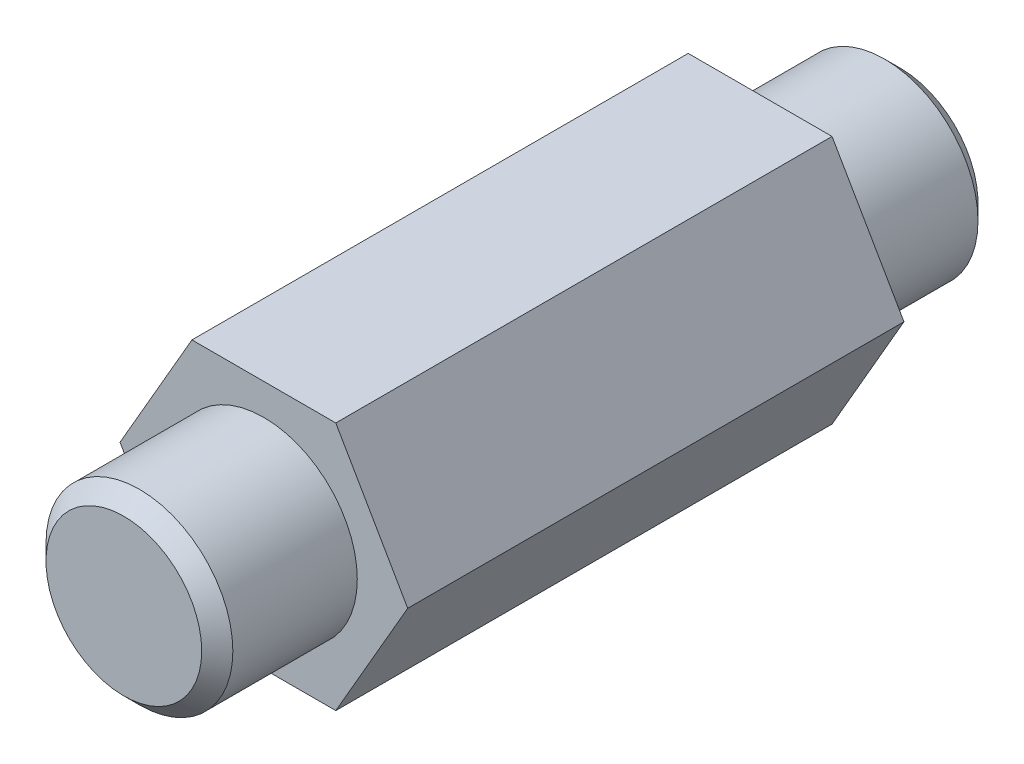
ISO-10303-21;
HEADER;
FILE_DESCRIPTION(('STEP AP214'),'2;1');
FILE_NAME('part.step','',(''),(''),'','','');
FILE_SCHEMA(('AUTOMOTIVE_DESIGN { 1 0 10303 214 1 1 1 1 }'));
ENDSEC;
DATA;
#1=APPLICATION_CONTEXT('core data for automotive mechanical design processes');
#2=APPLICATION_PROTOCOL_DEFINITION('international standard','automotive_design',2000,#1);
#3=PRODUCT_CONTEXT('',#1,'mechanical');
#4=PRODUCT('Part','Part','',(#3));
#5=PRODUCT_RELATED_PRODUCT_CATEGORY('part','',(#4));
#6=PRODUCT_DEFINITION_FORMATION('','',#4);
#7=PRODUCT_DEFINITION_CONTEXT('part definition',#1,'design');
#8=PRODUCT_DEFINITION('design','',#6,#7);
#9=PRODUCT_DEFINITION_SHAPE('','',#8);
#10=(LENGTH_UNIT() NAMED_UNIT(*) SI_UNIT(.MILLI.,.METRE.));
#11=(NAMED_UNIT(*) PLANE_ANGLE_UNIT() SI_UNIT($,.RADIAN.));
#12=(NAMED_UNIT(*) SI_UNIT($,.STERADIAN.) SOLID_ANGLE_UNIT());
#13=UNCERTAINTY_MEASURE_WITH_UNIT(LENGTH_MEASURE(1.E-05),#10,'distance_accuracy_value','');
#14=(GEOMETRIC_REPRESENTATION_CONTEXT(3) GLOBAL_UNCERTAINTY_ASSIGNED_CONTEXT((#13)) GLOBAL_UNIT_ASSIGNED_CONTEXT((#10,
#11,#12)) REPRESENTATION_CONTEXT('',''));
#15=CARTESIAN_POINT('',(0.,0.,0.));
#16=DIRECTION('',(0.,0.,1.));
#17=DIRECTION('',(1.,0.,0.));
#18=AXIS2_PLACEMENT_3D('',#15,#16,#17);
#19=CARTESIAN_POINT('',(-3.66617420935412,-6.35,19.7866));
#20=DIRECTION('',(0.,1.,0.));
#21=DIRECTION('',(0.,0.,1.));
#22=AXIS2_PLACEMENT_3D('',#19,#20,#21);
#23=PLANE('',#22);
#24=DIRECTION('',(-1.,0.,0.));
#25=VECTOR('',#24,1.);
#26=CARTESIAN_POINT('',(-3.66617420935412,-6.35,-12.6492));
#27=LINE('',#26,#25);
#28=CARTESIAN_POINT('',(3.66617420935412,-6.35,-12.6492));
#29=VERTEX_POINT('',#28);
#30=CARTESIAN_POINT('',(-3.66617420935412,-6.35,-12.6492));
#31=VERTEX_POINT('',#30);
#32=EDGE_CURVE('E48',#29,#31,#27,.T.);
#33=ORIENTED_EDGE('',*,*,#32,.F.);
#34=DIRECTION('',(0.,0.,-1.));
#35=VECTOR('',#34,1.);
#36=CARTESIAN_POINT('',(3.66617420935412,-6.35,19.7866));
#37=LINE('',#36,#35);
#38=CARTESIAN_POINT('',(3.66617420935412,-6.35,12.6492));
#39=VERTEX_POINT('',#38);
#40=EDGE_CURVE('E115',#39,#29,#37,.T.);
#41=ORIENTED_EDGE('',*,*,#40,.F.);
#42=DIRECTION('',(1.,0.,0.));
#43=VECTOR('',#42,1.);
#44=CARTESIAN_POINT('',(-3.66617420935412,-6.35,12.6492));
#45=LINE('',#44,#43);
#46=CARTESIAN_POINT('',(-3.66617420935412,-6.35,12.6492));
#47=VERTEX_POINT('',#46);
#48=EDGE_CURVE('E106',#47,#39,#45,.T.);
#49=ORIENTED_EDGE('',*,*,#48,.F.);
#50=DIRECTION('',(0.,0.,-1.));
#51=VECTOR('',#50,1.);
#52=CARTESIAN_POINT('',(-3.66617420935412,-6.35,19.7866));
#53=LINE('',#52,#51);
#54=EDGE_CURVE('E102',#47,#31,#53,.T.);
#55=ORIENTED_EDGE('',*,*,#54,.T.);
#56=EDGE_LOOP('',(#33,#41,#49,#55));
#57=FACE_BOUND('',#56,.T.);
#58=ADVANCED_FACE('F35',(#57),#23,.F.);
#59=CARTESIAN_POINT('',(3.66617420935412,-6.35,19.7866));
#60=DIRECTION('',(-0.866025403784439,0.5,0.));
#61=DIRECTION('',(-0.5,-0.866025403784439,0.));
#62=AXIS2_PLACEMENT_3D('',#59,#60,#61);
#63=PLANE('',#62);
#64=DIRECTION('',(-0.5,-0.866025403784439,0.));
#65=VECTOR('',#64,1.);
#66=CARTESIAN_POINT('',(3.66617420935412,-6.35,-12.6492));
#67=LINE('',#66,#65);
#68=CARTESIAN_POINT('',(7.33234841870824,0.,-12.6492));
#69=VERTEX_POINT('',#68);
#70=EDGE_CURVE('E140',#69,#29,#67,.T.);
#71=ORIENTED_EDGE('',*,*,#70,.F.);
#72=DIRECTION('',(0.,0.,-1.));
#73=VECTOR('',#72,1.);
#74=CARTESIAN_POINT('',(7.33234841870824,0.,19.7866));
#75=LINE('',#74,#73);
#76=CARTESIAN_POINT('',(7.33234841870824,0.,12.6492));
#77=VERTEX_POINT('',#76);
#78=EDGE_CURVE('E112',#77,#69,#75,.T.);
#79=ORIENTED_EDGE('',*,*,#78,.F.);
#80=DIRECTION('',(0.5,0.866025403784439,0.));
#81=VECTOR('',#80,1.);
#82=CARTESIAN_POINT('',(3.66617420935412,-6.35,12.6492));
#83=LINE('',#82,#81);
#84=EDGE_CURVE('E122',#39,#77,#83,.T.);
#85=ORIENTED_EDGE('',*,*,#84,.F.);
#86=ORIENTED_EDGE('',*,*,#40,.T.);
#87=EDGE_LOOP('',(#71,#79,#85,#86));
#88=FACE_BOUND('',#87,.T.);
#89=ADVANCED_FACE('F172',(#88),#63,.F.);
#90=CARTESIAN_POINT('',(7.33234841870824,0.,19.7866));
#91=DIRECTION('',(-0.866025403784438,-0.5,0.));
#92=DIRECTION('',(0.5,-0.866025403784438,0.));
#93=AXIS2_PLACEMENT_3D('',#90,#91,#92);
#94=PLANE('',#93);
#95=DIRECTION('',(0.5,-0.866025403784438,0.));
#96=VECTOR('',#95,1.);
#97=CARTESIAN_POINT('',(7.33234841870824,0.,-12.6492));
#98=LINE('',#97,#96);
#99=CARTESIAN_POINT('',(3.66617420935412,6.35,-12.6492));
#100=VERTEX_POINT('',#99);
#101=EDGE_CURVE('E142',#100,#69,#98,.T.);
#102=ORIENTED_EDGE('',*,*,#101,.F.);
#103=DIRECTION('',(0.,0.,-1.));
#104=VECTOR('',#103,1.);
#105=CARTESIAN_POINT('',(3.66617420935412,6.35,19.7866));
#106=LINE('',#105,#104);
#107=CARTESIAN_POINT('',(3.66617420935412,6.35,12.6492));
#108=VERTEX_POINT('',#107);
#109=EDGE_CURVE('E104',#108,#100,#106,.T.);
#110=ORIENTED_EDGE('',*,*,#109,.F.);
#111=DIRECTION('',(-0.5,0.866025403784438,0.));
#112=VECTOR('',#111,1.);
#113=CARTESIAN_POINT('',(7.33234841870824,0.,12.6492));
#114=LINE('',#113,#112);
#115=EDGE_CURVE('E123',#77,#108,#114,.T.);
#116=ORIENTED_EDGE('',*,*,#115,.F.);
#117=ORIENTED_EDGE('',*,*,#78,.T.);
#118=EDGE_LOOP('',(#102,#110,#116,#117));
#119=FACE_BOUND('',#118,.T.);
#120=ADVANCED_FACE('F176',(#119),#94,.F.);
#121=CARTESIAN_POINT('',(3.66617420935412,6.35,19.7866));
#122=DIRECTION('',(0.,-1.,0.));
#123=DIRECTION('',(1.,0.,0.));
#124=AXIS2_PLACEMENT_3D('',#121,#122,#123);
#125=PLANE('',#124);
#126=DIRECTION('',(1.,0.,0.));
#127=VECTOR('',#126,1.);
#128=CARTESIAN_POINT('',(3.66617420935412,6.35,-12.6492));
#129=LINE('',#128,#127);
#130=CARTESIAN_POINT('',(-3.66617420935412,6.35,-12.6492));
#131=VERTEX_POINT('',#130);
#132=EDGE_CURVE('E98',#131,#100,#129,.T.);
#133=ORIENTED_EDGE('',*,*,#132,.F.);
#134=DIRECTION('',(0.,0.,-1.));
#135=VECTOR('',#134,1.);
#136=CARTESIAN_POINT('',(-3.66617420935412,6.35,19.7866));
#137=LINE('',#136,#135);
#138=CARTESIAN_POINT('',(-3.66617420935412,6.35,12.6492));
#139=VERTEX_POINT('',#138);
#140=EDGE_CURVE('E97',#139,#131,#137,.T.);
#141=ORIENTED_EDGE('',*,*,#140,.F.);
#142=DIRECTION('',(-1.,0.,0.));
#143=VECTOR('',#142,1.);
#144=CARTESIAN_POINT('',(3.66617420935412,6.35,12.6492));
#145=LINE('',#144,#143);
#146=EDGE_CURVE('E127',#108,#139,#145,.T.);
#147=ORIENTED_EDGE('',*,*,#146,.F.);
#148=ORIENTED_EDGE('',*,*,#109,.T.);
#149=EDGE_LOOP('',(#133,#141,#147,#148));
#150=FACE_BOUND('',#149,.T.);
#151=ADVANCED_FACE('F181',(#150),#125,.F.);
#152=CARTESIAN_POINT('',(-3.66617420935412,6.35,19.7866));
#153=DIRECTION('',(0.866025403784439,-0.5,0.));
#154=DIRECTION('',(0.5,0.866025403784439,0.));
#155=AXIS2_PLACEMENT_3D('',#152,#153,#154);
#156=PLANE('',#155);
#157=DIRECTION('',(0.5,0.866025403784439,0.));
#158=VECTOR('',#157,1.);
#159=CARTESIAN_POINT('',(-3.66617420935412,6.35,-12.6492));
#160=LINE('',#159,#158);
#161=CARTESIAN_POINT('',(-7.33234841870824,0.,-12.6492));
#162=VERTEX_POINT('',#161);
#163=EDGE_CURVE('E85',#162,#131,#160,.T.);
#164=ORIENTED_EDGE('',*,*,#163,.F.);
#165=DIRECTION('',(0.,0.,-1.));
#166=VECTOR('',#165,1.);
#167=CARTESIAN_POINT('',(-7.33234841870824,0.,19.7866));
#168=LINE('',#167,#166);
#169=CARTESIAN_POINT('',(-7.33234841870824,0.,12.6492));
#170=VERTEX_POINT('',#169);
#171=EDGE_CURVE('E95',#170,#162,#168,.T.);
#172=ORIENTED_EDGE('',*,*,#171,.F.);
#173=DIRECTION('',(-0.5,-0.866025403784439,0.));
#174=VECTOR('',#173,1.);
#175=CARTESIAN_POINT('',(-3.66617420935412,6.35,12.6492));
#176=LINE('',#175,#174);
#177=EDGE_CURVE('E56',#139,#170,#176,.T.);
#178=ORIENTED_EDGE('',*,*,#177,.F.);
#179=ORIENTED_EDGE('',*,*,#140,.T.);
#180=EDGE_LOOP('',(#164,#172,#178,#179));
#181=FACE_BOUND('',#180,.T.);
#182=ADVANCED_FACE('F94',(#181),#156,.F.);
#183=CARTESIAN_POINT('',(-7.33234841870824,0.,19.7866));
#184=DIRECTION('',(0.866025403784438,0.5,0.));
#185=DIRECTION('',(-0.5,0.866025403784439,0.));
#186=AXIS2_PLACEMENT_3D('',#183,#184,#185);
#187=PLANE('',#186);
#188=DIRECTION('',(-0.5,0.866025403784439,0.));
#189=VECTOR('',#188,1.);
#190=CARTESIAN_POINT('',(-7.33234841870824,0.,-12.6492));
#191=LINE('',#190,#189);
#192=EDGE_CURVE('E11',#31,#162,#191,.T.);
#193=ORIENTED_EDGE('',*,*,#192,.F.);
#194=ORIENTED_EDGE('',*,*,#54,.F.);
#195=DIRECTION('',(0.5,-0.866025403784439,0.));
#196=VECTOR('',#195,1.);
#197=CARTESIAN_POINT('',(-7.33234841870824,0.,12.6492));
#198=LINE('',#197,#196);
#199=EDGE_CURVE('E42',#170,#47,#198,.T.);
#200=ORIENTED_EDGE('',*,*,#199,.F.);
#201=ORIENTED_EDGE('',*,*,#171,.T.);
#202=EDGE_LOOP('',(#193,#194,#200,#201));
#203=FACE_BOUND('',#202,.T.);
#204=ADVANCED_FACE('F101',(#203),#187,.F.);
#205=CARTESIAN_POINT('',(-4.7625,0.,12.6492));
#206=DIRECTION('',(0.,0.,1.));
#207=DIRECTION('',(1.,0.,0.));
#208=AXIS2_PLACEMENT_3D('',#205,#206,#207);
#209=PLANE('',#208);
#210=CARTESIAN_POINT('',(0.,0.,12.6492));
#211=DIRECTION('',(0.,0.,1.));
#212=DIRECTION('',(1.,0.,0.));
#213=AXIS2_PLACEMENT_3D('',#210,#211,#212);
#214=CIRCLE('',#213,4.7625);
#215=CARTESIAN_POINT('',(4.7625,0.,12.6492));
#216=VERTEX_POINT('',#215);
#217=EDGE_CURVE('E136',#216,#216,#214,.T.);
#218=ORIENTED_EDGE('',*,*,#217,.F.);
#219=EDGE_LOOP('',(#218));
#220=FACE_BOUND('',#219,.T.);
#221=ORIENTED_EDGE('',*,*,#48,.T.);
#222=ORIENTED_EDGE('',*,*,#84,.T.);
#223=ORIENTED_EDGE('',*,*,#115,.T.);
#224=ORIENTED_EDGE('',*,*,#146,.T.);
#225=ORIENTED_EDGE('',*,*,#177,.T.);
#226=ORIENTED_EDGE('',*,*,#199,.T.);
#227=EDGE_LOOP('',(#221,#222,#223,#224,#225,#226));
#228=FACE_BOUND('',#227,.T.);
#229=ADVANCED_FACE('F118',(#220,#228),#209,.T.);
#230=CARTESIAN_POINT('',(0.,0.,19.7866));
#231=DIRECTION('',(0.,0.,-1.));
#232=DIRECTION('',(-1.,0.,0.));
#233=AXIS2_PLACEMENT_3D('',#230,#231,#232);
#234=CONICAL_SURFACE('',#233,3.96875,0.78539816339745);
#235=CARTESIAN_POINT('',(0.,0.,18.99285));
#236=DIRECTION('',(0.,0.,1.));
#237=DIRECTION('',(1.,0.,0.));
#238=AXIS2_PLACEMENT_3D('',#235,#236,#237);
#239=CIRCLE('',#238,4.7625);
#240=CARTESIAN_POINT('',(4.7625,0.,18.99285));
#241=VERTEX_POINT('',#240);
#242=EDGE_CURVE('E133',#241,#241,#239,.T.);
#243=ORIENTED_EDGE('',*,*,#242,.T.);
#244=EDGE_LOOP('',(#243));
#245=FACE_BOUND('',#244,.T.);
#246=CARTESIAN_POINT('',(0.,0.,19.7866));
#247=DIRECTION('',(0.,0.,1.));
#248=DIRECTION('',(1.,0.,0.));
#249=AXIS2_PLACEMENT_3D('',#246,#247,#248);
#250=CIRCLE('',#249,3.96875);
#251=CARTESIAN_POINT('',(3.96875,0.,19.7866));
#252=VERTEX_POINT('',#251);
#253=EDGE_CURVE('E130',#252,#252,#250,.T.);
#254=ORIENTED_EDGE('',*,*,#253,.F.);
#255=EDGE_LOOP('',(#254));
#256=FACE_BOUND('',#255,.T.);
#257=ADVANCED_FACE('F197',(#245,#256),#234,.T.);
#258=CARTESIAN_POINT('',(0.,0.,19.7866));
#259=DIRECTION('',(0.,0.,1.));
#260=DIRECTION('',(1.,0.,0.));
#261=AXIS2_PLACEMENT_3D('',#258,#259,#260);
#262=CYLINDRICAL_SURFACE('',#261,4.7625);
#263=ORIENTED_EDGE('',*,*,#217,.T.);
#264=EDGE_LOOP('',(#263));
#265=FACE_BOUND('',#264,.T.);
#266=ORIENTED_EDGE('',*,*,#242,.F.);
#267=EDGE_LOOP('',(#266));
#268=FACE_BOUND('',#267,.T.);
#269=ADVANCED_FACE('F167',(#265,#268),#262,.T.);
#270=CARTESIAN_POINT('',(0.,0.,19.7866));
#271=DIRECTION('',(0.,0.,1.));
#272=DIRECTION('',(1.,0.,0.));
#273=AXIS2_PLACEMENT_3D('',#270,#271,#272);
#274=PLANE('',#273);
#275=ORIENTED_EDGE('',*,*,#253,.T.);
#276=EDGE_LOOP('',(#275));
#277=FACE_BOUND('',#276,.T.);
#278=ADVANCED_FACE('F159',(#277),#274,.T.);
#279=CARTESIAN_POINT('',(-4.7625,0.,-12.6492));
#280=DIRECTION('',(0.,0.,-1.));
#281=DIRECTION('',(-1.,0.,0.));
#282=AXIS2_PLACEMENT_3D('',#279,#280,#281);
#283=PLANE('',#282);
#284=CARTESIAN_POINT('',(0.,0.,-12.6492));
#285=DIRECTION('',(0.,0.,-1.));
#286=DIRECTION('',(-1.,0.,0.));
#287=AXIS2_PLACEMENT_3D('',#284,#285,#286);
#288=CIRCLE('',#287,4.7625);
#289=CARTESIAN_POINT('',(-4.7625,0.,-12.6492));
#290=VERTEX_POINT('',#289);
#291=EDGE_CURVE('E150',#290,#290,#288,.T.);
#292=ORIENTED_EDGE('',*,*,#291,.F.);
#293=EDGE_LOOP('',(#292));
#294=FACE_BOUND('',#293,.T.);
#295=ORIENTED_EDGE('',*,*,#32,.T.);
#296=ORIENTED_EDGE('',*,*,#192,.T.);
#297=ORIENTED_EDGE('',*,*,#163,.T.);
#298=ORIENTED_EDGE('',*,*,#132,.T.);
#299=ORIENTED_EDGE('',*,*,#101,.T.);
#300=ORIENTED_EDGE('',*,*,#70,.T.);
#301=EDGE_LOOP('',(#295,#296,#297,#298,#299,#300));
#302=FACE_BOUND('',#301,.T.);
#303=ADVANCED_FACE('F84',(#294,#302),#283,.T.);
#304=CARTESIAN_POINT('',(0.,0.,-19.7866));
#305=DIRECTION('',(0.,0.,1.));
#306=DIRECTION('',(1.,0.,0.));
#307=AXIS2_PLACEMENT_3D('',#304,#305,#306);
#308=CONICAL_SURFACE('',#307,3.96875,0.78539816339745);
#309=CARTESIAN_POINT('',(0.,0.,-18.99285));
#310=DIRECTION('',(0.,0.,-1.));
#311=DIRECTION('',(-1.,0.,0.));
#312=AXIS2_PLACEMENT_3D('',#309,#310,#311);
#313=CIRCLE('',#312,4.7625);
#314=CARTESIAN_POINT('',(-4.7625,0.,-18.99285));
#315=VERTEX_POINT('',#314);
#316=EDGE_CURVE('E147',#315,#315,#313,.T.);
#317=ORIENTED_EDGE('',*,*,#316,.T.);
#318=EDGE_LOOP('',(#317));
#319=FACE_BOUND('',#318,.T.);
#320=CARTESIAN_POINT('',(0.,0.,-19.7866));
#321=DIRECTION('',(0.,0.,-1.));
#322=DIRECTION('',(-1.,0.,0.));
#323=AXIS2_PLACEMENT_3D('',#320,#321,#322);
#324=CIRCLE('',#323,3.96875);
#325=CARTESIAN_POINT('',(-3.96875,0.,-19.7866));
#326=VERTEX_POINT('',#325);
#327=EDGE_CURVE('E99',#326,#326,#324,.T.);
#328=ORIENTED_EDGE('',*,*,#327,.F.);
#329=EDGE_LOOP('',(#328));
#330=FACE_BOUND('',#329,.T.);
#331=ADVANCED_FACE('F158',(#319,#330),#308,.T.);
#332=CARTESIAN_POINT('',(0.,0.,-19.7866));
#333=DIRECTION('',(0.,0.,-1.));
#334=DIRECTION('',(-1.,0.,0.));
#335=AXIS2_PLACEMENT_3D('',#332,#333,#334);
#336=CYLINDRICAL_SURFACE('',#335,4.7625);
#337=ORIENTED_EDGE('',*,*,#291,.T.);
#338=EDGE_LOOP('',(#337));
#339=FACE_BOUND('',#338,.T.);
#340=ORIENTED_EDGE('',*,*,#316,.F.);
#341=EDGE_LOOP('',(#340));
#342=FACE_BOUND('',#341,.T.);
#343=ADVANCED_FACE('F154',(#339,#342),#336,.T.);
#344=CARTESIAN_POINT('',(0.,0.,-19.7866));
#345=DIRECTION('',(0.,0.,1.));
#346=DIRECTION('',(1.,0.,0.));
#347=AXIS2_PLACEMENT_3D('',#344,#345,#346);
#348=PLANE('',#347);
#349=ORIENTED_EDGE('',*,*,#327,.T.);
#350=EDGE_LOOP('',(#349));
#351=FACE_BOUND('',#350,.T.);
#352=ADVANCED_FACE('F193',(#351),#348,.F.);
#353=CLOSED_SHELL('',(#58,#89,#120,#151,#182,#204,#229,#257,#269,#278,#303,#331,#343,#352));
#354=MANIFOLD_SOLID_BREP('B2',#353);
#355=ADVANCED_BREP_SHAPE_REPRESENTATION('',(#18,#354),#14);
#356=SHAPE_DEFINITION_REPRESENTATION(#9,#355);
ENDSEC;
END-ISO-10303-21;
